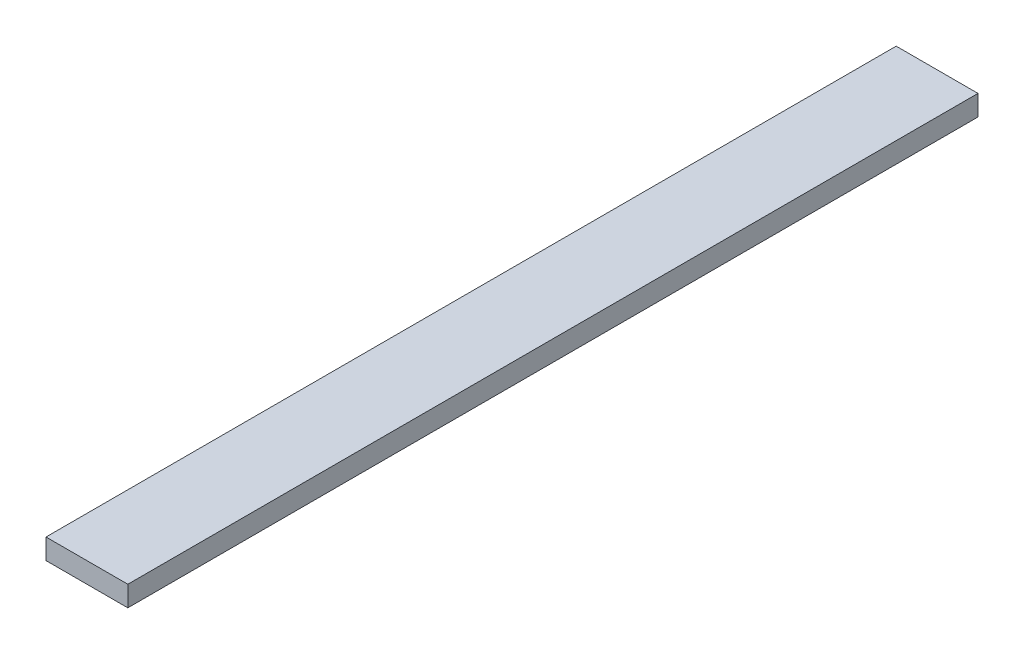
ISO-10303-21;
HEADER;
FILE_DESCRIPTION(('STEP AP214'),'2;1');
FILE_NAME('part.step','',(''),(''),'','','');
FILE_SCHEMA(('AUTOMOTIVE_DESIGN { 1 0 10303 214 1 1 1 1 }'));
ENDSEC;
DATA;
#1=APPLICATION_CONTEXT('core data for automotive mechanical design processes');
#2=APPLICATION_PROTOCOL_DEFINITION('international standard','automotive_design',2000,#1);
#3=PRODUCT_CONTEXT('',#1,'mechanical');
#4=PRODUCT('Part','Part','',(#3));
#5=PRODUCT_RELATED_PRODUCT_CATEGORY('part','',(#4));
#6=PRODUCT_DEFINITION_FORMATION('','',#4);
#7=PRODUCT_DEFINITION_CONTEXT('part definition',#1,'design');
#8=PRODUCT_DEFINITION('design','',#6,#7);
#9=PRODUCT_DEFINITION_SHAPE('','',#8);
#10=(LENGTH_UNIT() NAMED_UNIT(*) SI_UNIT(.MILLI.,.METRE.));
#11=(NAMED_UNIT(*) PLANE_ANGLE_UNIT() SI_UNIT($,.RADIAN.));
#12=(NAMED_UNIT(*) SI_UNIT($,.STERADIAN.) SOLID_ANGLE_UNIT());
#13=UNCERTAINTY_MEASURE_WITH_UNIT(LENGTH_MEASURE(1.E-05),#10,'distance_accuracy_value','');
#14=(GEOMETRIC_REPRESENTATION_CONTEXT(3) GLOBAL_UNCERTAINTY_ASSIGNED_CONTEXT((#13)) GLOBAL_UNIT_ASSIGNED_CONTEXT((#10,
#11,#12)) REPRESENTATION_CONTEXT('',''));
#15=CARTESIAN_POINT('',(0.,0.,0.));
#16=DIRECTION('',(0.,0.,1.));
#17=DIRECTION('',(1.,0.,0.));
#18=AXIS2_PLACEMENT_3D('',#15,#16,#17);
#19=CARTESIAN_POINT('',(0.,38.1,0.));
#20=DIRECTION('',(1.,0.,0.));
#21=DIRECTION('',(0.,0.,-1.));
#22=AXIS2_PLACEMENT_3D('',#19,#20,#21);
#23=PLANE('',#22);
#24=DIRECTION('',(0.,0.,1.));
#25=VECTOR('',#24,1.);
#26=CARTESIAN_POINT('',(0.,0.,0.));
#27=LINE('',#26,#25);
#28=CARTESIAN_POINT('',(0.,0.,-1583.5));
#29=VERTEX_POINT('',#28);
#30=CARTESIAN_POINT('',(0.,0.,0.));
#31=VERTEX_POINT('',#30);
#32=EDGE_CURVE('E97',#29,#31,#27,.T.);
#33=ORIENTED_EDGE('',*,*,#32,.T.);
#34=DIRECTION('',(0.,-1.,0.));
#35=VECTOR('',#34,1.);
#36=CARTESIAN_POINT('',(0.,38.1,0.));
#37=LINE('',#36,#35);
#38=CARTESIAN_POINT('',(0.,38.1,0.));
#39=VERTEX_POINT('',#38);
#40=EDGE_CURVE('E11',#39,#31,#37,.T.);
#41=ORIENTED_EDGE('',*,*,#40,.F.);
#42=DIRECTION('',(0.,0.,1.));
#43=VECTOR('',#42,1.);
#44=CARTESIAN_POINT('',(0.,38.1,0.));
#45=LINE('',#44,#43);
#46=CARTESIAN_POINT('',(0.,38.1,-1583.5));
#47=VERTEX_POINT('',#46);
#48=EDGE_CURVE('E85',#47,#39,#45,.T.);
#49=ORIENTED_EDGE('',*,*,#48,.F.);
#50=DIRECTION('',(0.,-1.,0.));
#51=VECTOR('',#50,1.);
#52=CARTESIAN_POINT('',(0.,38.1,-1583.5));
#53=LINE('',#52,#51);
#54=EDGE_CURVE('E93',#47,#29,#53,.T.);
#55=ORIENTED_EDGE('',*,*,#54,.T.);
#56=EDGE_LOOP('',(#33,#41,#49,#55));
#57=FACE_BOUND('',#56,.T.);
#58=ADVANCED_FACE('F34',(#57),#23,.F.);
#59=CARTESIAN_POINT('',(0.,38.1,0.));
#60=DIRECTION('',(0.,0.,-1.));
#61=DIRECTION('',(-1.,0.,0.));
#62=AXIS2_PLACEMENT_3D('',#59,#60,#61);
#63=PLANE('',#62);
#64=DIRECTION('',(1.,0.,0.));
#65=VECTOR('',#64,1.);
#66=CARTESIAN_POINT('',(0.,0.,0.));
#67=LINE('',#66,#65);
#68=CARTESIAN_POINT('',(152.4,0.,0.));
#69=VERTEX_POINT('',#68);
#70=EDGE_CURVE('E89',#31,#69,#67,.T.);
#71=ORIENTED_EDGE('',*,*,#70,.T.);
#72=DIRECTION('',(0.,-1.,0.));
#73=VECTOR('',#72,1.);
#74=CARTESIAN_POINT('',(152.4,38.1,0.));
#75=LINE('',#74,#73);
#76=CARTESIAN_POINT('',(152.4,38.1,0.));
#77=VERTEX_POINT('',#76);
#78=EDGE_CURVE('E42',#77,#69,#75,.T.);
#79=ORIENTED_EDGE('',*,*,#78,.F.);
#80=DIRECTION('',(1.,0.,0.));
#81=VECTOR('',#80,1.);
#82=CARTESIAN_POINT('',(0.,38.1,0.));
#83=LINE('',#82,#81);
#84=EDGE_CURVE('E80',#39,#77,#83,.T.);
#85=ORIENTED_EDGE('',*,*,#84,.F.);
#86=ORIENTED_EDGE('',*,*,#40,.T.);
#87=EDGE_LOOP('',(#71,#79,#85,#86));
#88=FACE_BOUND('',#87,.T.);
#89=ADVANCED_FACE('F88',(#88),#63,.F.);
#90=CARTESIAN_POINT('',(152.4,38.1,0.));
#91=DIRECTION('',(-1.,0.,0.));
#92=DIRECTION('',(0.,0.,1.));
#93=AXIS2_PLACEMENT_3D('',#90,#91,#92);
#94=PLANE('',#93);
#95=DIRECTION('',(0.,0.,-1.));
#96=VECTOR('',#95,1.);
#97=CARTESIAN_POINT('',(152.4,0.,0.));
#98=LINE('',#97,#96);
#99=CARTESIAN_POINT('',(152.4,0.,-1583.5));
#100=VERTEX_POINT('',#99);
#101=EDGE_CURVE('E67',#69,#100,#98,.T.);
#102=ORIENTED_EDGE('',*,*,#101,.T.);
#103=DIRECTION('',(0.,-1.,0.));
#104=VECTOR('',#103,1.);
#105=CARTESIAN_POINT('',(152.4,38.1,-1583.5));
#106=LINE('',#105,#104);
#107=CARTESIAN_POINT('',(152.4,38.1,-1583.5));
#108=VERTEX_POINT('',#107);
#109=EDGE_CURVE('E90',#108,#100,#106,.T.);
#110=ORIENTED_EDGE('',*,*,#109,.F.);
#111=DIRECTION('',(0.,0.,-1.));
#112=VECTOR('',#111,1.);
#113=CARTESIAN_POINT('',(152.4,38.1,0.));
#114=LINE('',#113,#112);
#115=EDGE_CURVE('E83',#77,#108,#114,.T.);
#116=ORIENTED_EDGE('',*,*,#115,.F.);
#117=ORIENTED_EDGE('',*,*,#78,.T.);
#118=EDGE_LOOP('',(#102,#110,#116,#117));
#119=FACE_BOUND('',#118,.T.);
#120=ADVANCED_FACE('F91',(#119),#94,.F.);
#121=CARTESIAN_POINT('',(0.,38.1,-1583.5));
#122=DIRECTION('',(0.,0.,1.));
#123=DIRECTION('',(1.,0.,0.));
#124=AXIS2_PLACEMENT_3D('',#121,#122,#123);
#125=PLANE('',#124);
#126=DIRECTION('',(-1.,0.,0.));
#127=VECTOR('',#126,1.);
#128=CARTESIAN_POINT('',(0.,0.,-1583.5));
#129=LINE('',#128,#127);
#130=EDGE_CURVE('E73',#100,#29,#129,.T.);
#131=ORIENTED_EDGE('',*,*,#130,.T.);
#132=ORIENTED_EDGE('',*,*,#54,.F.);
#133=DIRECTION('',(-1.,0.,0.));
#134=VECTOR('',#133,1.);
#135=CARTESIAN_POINT('',(0.,38.1,-1583.5));
#136=LINE('',#135,#134);
#137=EDGE_CURVE('E50',#108,#47,#136,.T.);
#138=ORIENTED_EDGE('',*,*,#137,.F.);
#139=ORIENTED_EDGE('',*,*,#109,.T.);
#140=EDGE_LOOP('',(#131,#132,#138,#139));
#141=FACE_BOUND('',#140,.T.);
#142=ADVANCED_FACE('F104',(#141),#125,.F.);
#143=CARTESIAN_POINT('',(0.,38.1,0.));
#144=DIRECTION('',(0.,-1.,0.));
#145=DIRECTION('',(0.,0.,-1.));
#146=AXIS2_PLACEMENT_3D('',#143,#144,#145);
#147=PLANE('',#146);
#148=ORIENTED_EDGE('',*,*,#48,.T.);
#149=ORIENTED_EDGE('',*,*,#84,.T.);
#150=ORIENTED_EDGE('',*,*,#115,.T.);
#151=ORIENTED_EDGE('',*,*,#137,.T.);
#152=EDGE_LOOP('',(#148,#149,#150,#151));
#153=FACE_BOUND('',#152,.T.);
#154=ADVANCED_FACE('F81',(#153),#147,.F.);
#155=CARTESIAN_POINT('',(0.,0.,0.));
#156=DIRECTION('',(0.,-1.,0.));
#157=DIRECTION('',(0.,0.,-1.));
#158=AXIS2_PLACEMENT_3D('',#155,#156,#157);
#159=PLANE('',#158);
#160=ORIENTED_EDGE('',*,*,#32,.F.);
#161=ORIENTED_EDGE('',*,*,#130,.F.);
#162=ORIENTED_EDGE('',*,*,#101,.F.);
#163=ORIENTED_EDGE('',*,*,#70,.F.);
#164=EDGE_LOOP('',(#160,#161,#162,#163));
#165=FACE_BOUND('',#164,.T.);
#166=ADVANCED_FACE('F107',(#165),#159,.T.);
#167=CLOSED_SHELL('',(#58,#89,#120,#142,#154,#166));
#168=MANIFOLD_SOLID_BREP('B2',#167);
#169=ADVANCED_BREP_SHAPE_REPRESENTATION('',(#18,#168),#14);
#170=SHAPE_DEFINITION_REPRESENTATION(#9,#169);
ENDSEC;
END-ISO-10303-21;
